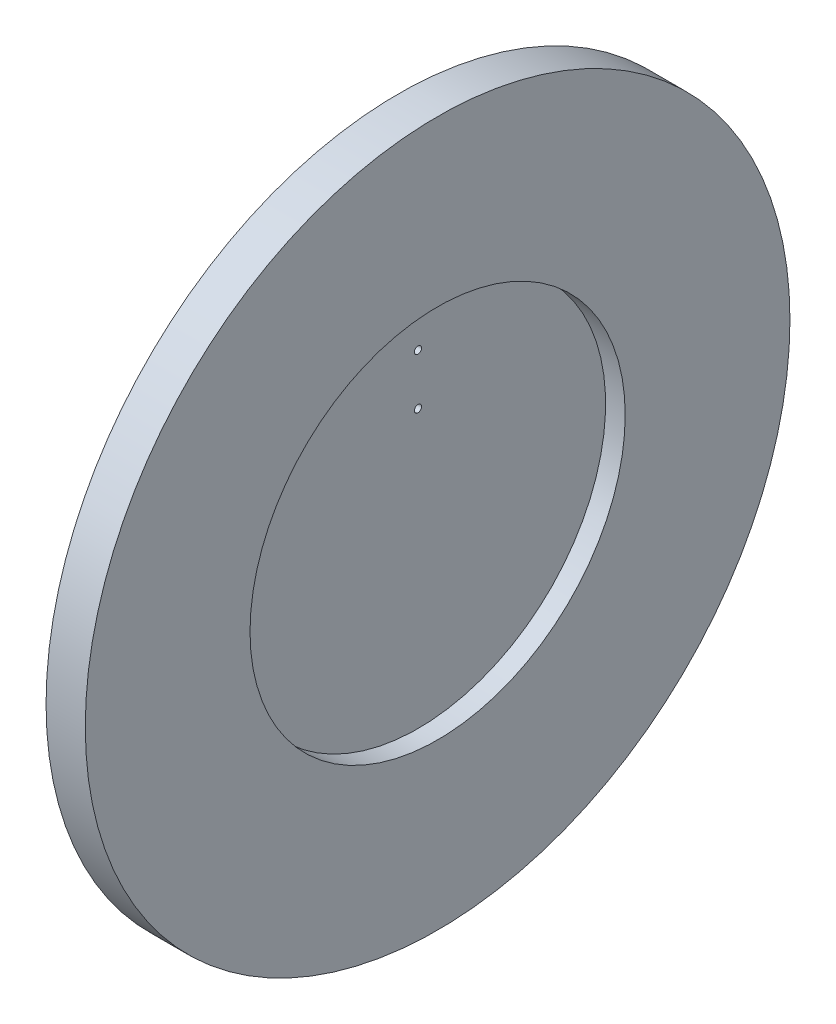
ISO-10303-21;
HEADER;
FILE_DESCRIPTION(('STEP AP214'),'2;1');
FILE_NAME('part.step','',(''),(''),'','','');
FILE_SCHEMA(('AUTOMOTIVE_DESIGN { 1 0 10303 214 1 1 1 1 }'));
ENDSEC;
DATA;
#1=APPLICATION_CONTEXT('core data for automotive mechanical design processes');
#2=APPLICATION_PROTOCOL_DEFINITION('international standard','automotive_design',2000,#1);
#3=PRODUCT_CONTEXT('',#1,'mechanical');
#4=PRODUCT('Part','Part','',(#3));
#5=PRODUCT_RELATED_PRODUCT_CATEGORY('part','',(#4));
#6=PRODUCT_DEFINITION_FORMATION('','',#4);
#7=PRODUCT_DEFINITION_CONTEXT('part definition',#1,'design');
#8=PRODUCT_DEFINITION('design','',#6,#7);
#9=PRODUCT_DEFINITION_SHAPE('','',#8);
#10=(LENGTH_UNIT() NAMED_UNIT(*) SI_UNIT(.MILLI.,.METRE.));
#11=(NAMED_UNIT(*) PLANE_ANGLE_UNIT() SI_UNIT($,.RADIAN.));
#12=(NAMED_UNIT(*) SI_UNIT($,.STERADIAN.) SOLID_ANGLE_UNIT());
#13=UNCERTAINTY_MEASURE_WITH_UNIT(LENGTH_MEASURE(1.E-05),#10,'distance_accuracy_value','');
#14=(GEOMETRIC_REPRESENTATION_CONTEXT(3) GLOBAL_UNCERTAINTY_ASSIGNED_CONTEXT((#13)) GLOBAL_UNIT_ASSIGNED_CONTEXT((#10,
#11,#12)) REPRESENTATION_CONTEXT('',''));
#15=CARTESIAN_POINT('',(0.,0.,0.));
#16=DIRECTION('',(0.,0.,1.));
#17=DIRECTION('',(1.,0.,0.));
#18=AXIS2_PLACEMENT_3D('',#15,#16,#17);
#19=CARTESIAN_POINT('',(10.,0.,0.));
#20=DIRECTION('',(-1.,0.,0.));
#21=DIRECTION('',(0.,0.,1.));
#22=AXIS2_PLACEMENT_3D('',#19,#20,#21);
#23=CYLINDRICAL_SURFACE('',#22,47.825);
#24=CARTESIAN_POINT('',(10.,0.,0.));
#25=DIRECTION('',(1.,0.,0.));
#26=DIRECTION('',(0.,0.,-1.));
#27=AXIS2_PLACEMENT_3D('',#24,#25,#26);
#28=CIRCLE('',#27,47.825);
#29=CARTESIAN_POINT('',(10.,0.,-47.825));
#30=VERTEX_POINT('',#29);
#31=EDGE_CURVE('E59',#30,#30,#28,.T.);
#32=ORIENTED_EDGE('',*,*,#31,.T.);
#33=EDGE_LOOP('',(#32));
#34=FACE_BOUND('',#33,.T.);
#35=CARTESIAN_POINT('',(5.,0.,0.));
#36=DIRECTION('',(-1.,0.,0.));
#37=DIRECTION('',(0.,0.,1.));
#38=AXIS2_PLACEMENT_3D('',#35,#36,#37);
#39=CIRCLE('',#38,47.825);
#40=CARTESIAN_POINT('',(5.,0.,47.825));
#41=VERTEX_POINT('',#40);
#42=EDGE_CURVE('E56',#41,#41,#39,.T.);
#43=ORIENTED_EDGE('',*,*,#42,.T.);
#44=EDGE_LOOP('',(#43));
#45=FACE_BOUND('',#44,.T.);
#46=ADVANCED_FACE('F39',(#34,#45),#23,.F.);
#47=CARTESIAN_POINT('',(10.,0.,0.));
#48=DIRECTION('',(1.,0.,0.));
#49=DIRECTION('',(0.,0.,-1.));
#50=AXIS2_PLACEMENT_3D('',#47,#48,#49);
#51=PLANE('',#50);
#52=CARTESIAN_POINT('',(10.,0.,0.));
#53=DIRECTION('',(1.,0.,0.));
#54=DIRECTION('',(0.,0.,-1.));
#55=AXIS2_PLACEMENT_3D('',#52,#53,#54);
#56=CIRCLE('',#55,89.825);
#57=CARTESIAN_POINT('',(10.,0.,-89.825));
#58=VERTEX_POINT('',#57);
#59=EDGE_CURVE('E47',#58,#58,#56,.T.);
#60=ORIENTED_EDGE('',*,*,#59,.T.);
#61=EDGE_LOOP('',(#60));
#62=FACE_BOUND('',#61,.T.);
#63=ORIENTED_EDGE('',*,*,#31,.F.);
#64=EDGE_LOOP('',(#63));
#65=FACE_BOUND('',#64,.T.);
#66=ADVANCED_FACE('F69',(#62,#65),#51,.T.);
#67=CARTESIAN_POINT('',(0.,0.,0.));
#68=DIRECTION('',(1.,0.,0.));
#69=DIRECTION('',(0.,0.,-1.));
#70=AXIS2_PLACEMENT_3D('',#67,#68,#69);
#71=PLANE('',#70);
#72=CARTESIAN_POINT('',(0.,0.,0.));
#73=DIRECTION('',(-1.,0.,0.));
#74=DIRECTION('',(0.,0.,1.));
#75=AXIS2_PLACEMENT_3D('',#72,#73,#74);
#76=CIRCLE('',#75,47.825);
#77=CARTESIAN_POINT('',(0.,0.,47.825));
#78=VERTEX_POINT('',#77);
#79=EDGE_CURVE('E10',#78,#78,#76,.T.);
#80=ORIENTED_EDGE('',*,*,#79,.F.);
#81=EDGE_LOOP('',(#80));
#82=FACE_BOUND('',#81,.T.);
#83=CARTESIAN_POINT('',(0.,0.,0.));
#84=DIRECTION('',(1.,0.,0.));
#85=DIRECTION('',(0.,0.,-1.));
#86=AXIS2_PLACEMENT_3D('',#83,#84,#85);
#87=CIRCLE('',#86,89.825);
#88=CARTESIAN_POINT('',(0.,0.,-89.825));
#89=VERTEX_POINT('',#88);
#90=EDGE_CURVE('E43',#89,#89,#87,.T.);
#91=ORIENTED_EDGE('',*,*,#90,.F.);
#92=EDGE_LOOP('',(#91));
#93=FACE_BOUND('',#92,.T.);
#94=ADVANCED_FACE('F67',(#82,#93),#71,.F.);
#95=CARTESIAN_POINT('',(10.,0.,0.));
#96=DIRECTION('',(-1.,0.,0.));
#97=DIRECTION('',(0.,0.,1.));
#98=AXIS2_PLACEMENT_3D('',#95,#96,#97);
#99=CYLINDRICAL_SURFACE('',#98,89.825);
#100=ORIENTED_EDGE('',*,*,#59,.F.);
#101=EDGE_LOOP('',(#100));
#102=FACE_BOUND('',#101,.T.);
#103=ORIENTED_EDGE('',*,*,#90,.T.);
#104=EDGE_LOOP('',(#103));
#105=FACE_BOUND('',#104,.T.);
#106=ADVANCED_FACE('F41',(#102,#105),#99,.T.);
#107=CARTESIAN_POINT('',(5.,0.,0.));
#108=DIRECTION('',(-1.,0.,0.));
#109=DIRECTION('',(0.,0.,1.));
#110=AXIS2_PLACEMENT_3D('',#107,#108,#109);
#111=PLANE('',#110);
#112=CARTESIAN_POINT('',(5.,22.8184983848622,0.));
#113=DIRECTION('',(-1.,0.,0.));
#114=DIRECTION('',(0.,0.,1.));
#115=AXIS2_PLACEMENT_3D('',#112,#113,#114);
#116=CIRCLE('',#115,0.914623685000002);
#117=CARTESIAN_POINT('',(5.,22.8184983848622,0.914623685000002));
#118=VERTEX_POINT('',#117);
#119=EDGE_CURVE('E111',#118,#118,#116,.F.);
#120=ORIENTED_EDGE('',*,*,#119,.F.);
#121=EDGE_LOOP('',(#120));
#122=FACE_BOUND('',#121,.T.);
#123=CARTESIAN_POINT('',(5.,35.7467016151378,0.));
#124=DIRECTION('',(-1.,0.,0.));
#125=DIRECTION('',(0.,0.,1.));
#126=AXIS2_PLACEMENT_3D('',#123,#124,#125);
#127=CIRCLE('',#126,0.914623684999991);
#128=CARTESIAN_POINT('',(5.,35.7467016151378,0.914623684999991));
#129=VERTEX_POINT('',#128);
#130=EDGE_CURVE('E117',#129,#129,#127,.F.);
#131=ORIENTED_EDGE('',*,*,#130,.F.);
#132=EDGE_LOOP('',(#131));
#133=FACE_BOUND('',#132,.T.);
#134=ORIENTED_EDGE('',*,*,#42,.F.);
#135=EDGE_LOOP('',(#134));
#136=FACE_BOUND('',#135,.T.);
#137=ADVANCED_FACE('F76',(#122,#133,#136),#111,.F.);
#138=CARTESIAN_POINT('',(-5.,0.,0.));
#139=DIRECTION('',(1.,0.,0.));
#140=DIRECTION('',(0.,0.,-1.));
#141=AXIS2_PLACEMENT_3D('',#138,#139,#140);
#142=CYLINDRICAL_SURFACE('',#141,47.825);
#143=CARTESIAN_POINT('',(-5.,0.,0.));
#144=DIRECTION('',(-1.,0.,0.));
#145=DIRECTION('',(0.,0.,1.));
#146=AXIS2_PLACEMENT_3D('',#143,#144,#145);
#147=CIRCLE('',#146,47.825);
#148=CARTESIAN_POINT('',(-5.,0.,47.825));
#149=VERTEX_POINT('',#148);
#150=EDGE_CURVE('E54',#149,#149,#147,.T.);
#151=ORIENTED_EDGE('',*,*,#150,.F.);
#152=EDGE_LOOP('',(#151));
#153=FACE_BOUND('',#152,.T.);
#154=ORIENTED_EDGE('',*,*,#79,.T.);
#155=EDGE_LOOP('',(#154));
#156=FACE_BOUND('',#155,.T.);
#157=ADVANCED_FACE('F88',(#153,#156),#142,.T.);
#158=CARTESIAN_POINT('',(-5.,0.,0.));
#159=DIRECTION('',(-1.,0.,0.));
#160=DIRECTION('',(0.,0.,1.));
#161=AXIS2_PLACEMENT_3D('',#158,#159,#160);
#162=PLANE('',#161);
#163=CARTESIAN_POINT('',(-5.,22.8184983848622,0.));
#164=DIRECTION('',(-1.,0.,0.));
#165=DIRECTION('',(0.,0.,1.));
#166=AXIS2_PLACEMENT_3D('',#163,#164,#165);
#167=CIRCLE('',#166,0.914623685000002);
#168=CARTESIAN_POINT('',(-5.,22.8184983848622,0.914623685000002));
#169=VERTEX_POINT('',#168);
#170=EDGE_CURVE('E108',#169,#169,#167,.T.);
#171=ORIENTED_EDGE('',*,*,#170,.F.);
#172=EDGE_LOOP('',(#171));
#173=FACE_BOUND('',#172,.T.);
#174=CARTESIAN_POINT('',(-5.,35.7467016151378,0.));
#175=DIRECTION('',(-1.,0.,0.));
#176=DIRECTION('',(0.,0.,-1.));
#177=AXIS2_PLACEMENT_3D('',#174,#175,#176);
#178=CIRCLE('',#177,0.914623684999991);
#179=CARTESIAN_POINT('',(-5.,35.7467016151378,-0.914623684999991));
#180=VERTEX_POINT('',#179);
#181=EDGE_CURVE('E114',#180,#180,#178,.T.);
#182=ORIENTED_EDGE('',*,*,#181,.F.);
#183=EDGE_LOOP('',(#182));
#184=FACE_BOUND('',#183,.T.);
#185=ORIENTED_EDGE('',*,*,#150,.T.);
#186=EDGE_LOOP('',(#185));
#187=FACE_BOUND('',#186,.T.);
#188=ADVANCED_FACE('F91',(#173,#184,#187),#162,.T.);
#189=CARTESIAN_POINT('',(10.001,35.7467016151378,0.));
#190=DIRECTION('',(-1.,0.,0.));
#191=DIRECTION('',(0.,0.,1.));
#192=AXIS2_PLACEMENT_3D('',#189,#190,#191);
#193=CYLINDRICAL_SURFACE('',#192,0.914623684999991);
#194=ORIENTED_EDGE('',*,*,#181,.T.);
#195=EDGE_LOOP('',(#194));
#196=FACE_BOUND('',#195,.T.);
#197=ORIENTED_EDGE('',*,*,#130,.T.);
#198=EDGE_LOOP('',(#197));
#199=FACE_BOUND('',#198,.T.);
#200=ADVANCED_FACE('F95',(#196,#199),#193,.F.);
#201=CARTESIAN_POINT('',(10.001,22.8184983848622,0.));
#202=DIRECTION('',(-1.,0.,0.));
#203=DIRECTION('',(0.,0.,1.));
#204=AXIS2_PLACEMENT_3D('',#201,#202,#203);
#205=CYLINDRICAL_SURFACE('',#204,0.914623685000002);
#206=ORIENTED_EDGE('',*,*,#170,.T.);
#207=EDGE_LOOP('',(#206));
#208=FACE_BOUND('',#207,.T.);
#209=ORIENTED_EDGE('',*,*,#119,.T.);
#210=EDGE_LOOP('',(#209));
#211=FACE_BOUND('',#210,.T.);
#212=ADVANCED_FACE('F99',(#208,#211),#205,.F.);
#213=CLOSED_SHELL('',(#46,#66,#94,#106,#137,#157,#188,#200,#212));
#214=MANIFOLD_SOLID_BREP('B2',#213);
#215=ADVANCED_BREP_SHAPE_REPRESENTATION('',(#18,#214),#14);
#216=SHAPE_DEFINITION_REPRESENTATION(#9,#215);
ENDSEC;
END-ISO-10303-21;
